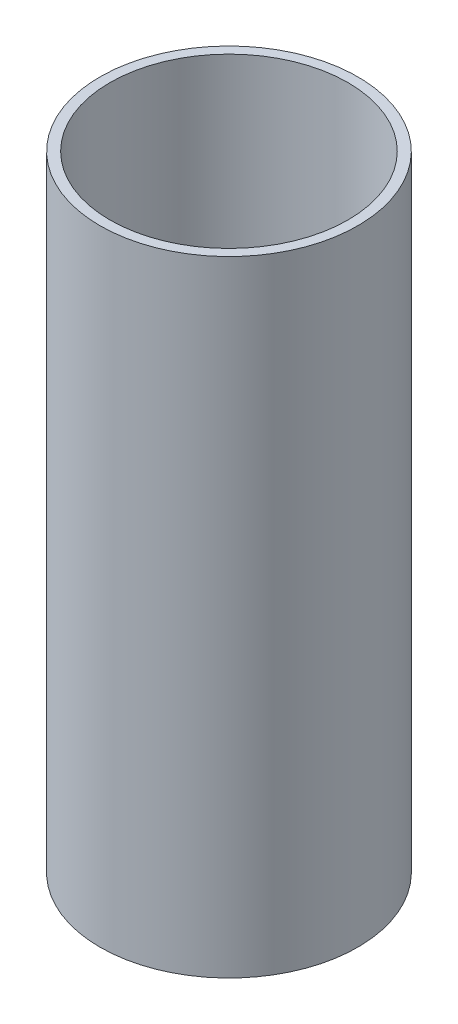
ISO-10303-21;
HEADER;
FILE_DESCRIPTION(('STEP AP214'),'2;1');
FILE_NAME('part.step','',(''),(''),'','','');
FILE_SCHEMA(('AUTOMOTIVE_DESIGN { 1 0 10303 214 1 1 1 1 }'));
ENDSEC;
DATA;
#1=APPLICATION_CONTEXT('core data for automotive mechanical design processes');
#2=APPLICATION_PROTOCOL_DEFINITION('international standard','automotive_design',2000,#1);
#3=PRODUCT_CONTEXT('',#1,'mechanical');
#4=PRODUCT('Part','Part','',(#3));
#5=PRODUCT_RELATED_PRODUCT_CATEGORY('part','',(#4));
#6=PRODUCT_DEFINITION_FORMATION('','',#4);
#7=PRODUCT_DEFINITION_CONTEXT('part definition',#1,'design');
#8=PRODUCT_DEFINITION('design','',#6,#7);
#9=PRODUCT_DEFINITION_SHAPE('','',#8);
#10=(LENGTH_UNIT() NAMED_UNIT(*) SI_UNIT(.MILLI.,.METRE.));
#11=(NAMED_UNIT(*) PLANE_ANGLE_UNIT() SI_UNIT($,.RADIAN.));
#12=(NAMED_UNIT(*) SI_UNIT($,.STERADIAN.) SOLID_ANGLE_UNIT());
#13=UNCERTAINTY_MEASURE_WITH_UNIT(LENGTH_MEASURE(1.E-05),#10,'distance_accuracy_value','');
#14=(GEOMETRIC_REPRESENTATION_CONTEXT(3) GLOBAL_UNCERTAINTY_ASSIGNED_CONTEXT((#13)) GLOBAL_UNIT_ASSIGNED_CONTEXT((#10,
#11,#12)) REPRESENTATION_CONTEXT('',''));
#15=CARTESIAN_POINT('',(0.,0.,0.));
#16=DIRECTION('',(0.,0.,1.));
#17=DIRECTION('',(1.,0.,0.));
#18=AXIS2_PLACEMENT_3D('',#15,#16,#17);
#19=CARTESIAN_POINT('',(0.,200.,0.));
#20=DIRECTION('',(0.,1.,0.));
#21=DIRECTION('',(0.,0.,1.));
#22=AXIS2_PLACEMENT_3D('',#19,#20,#21);
#23=PLANE('',#22);
#24=CARTESIAN_POINT('',(0.,200.,0.));
#25=DIRECTION('',(0.,1.,0.));
#26=DIRECTION('',(0.,0.,1.));
#27=AXIS2_PLACEMENT_3D('',#24,#25,#26);
#28=CIRCLE('',#27,41.275);
#29=CARTESIAN_POINT('',(0.,200.,41.275));
#30=VERTEX_POINT('',#29);
#31=EDGE_CURVE('E10',#30,#30,#28,.T.);
#32=ORIENTED_EDGE('',*,*,#31,.T.);
#33=EDGE_LOOP('',(#32));
#34=FACE_BOUND('',#33,.T.);
#35=CARTESIAN_POINT('',(0.,200.,0.));
#36=DIRECTION('',(0.,1.,0.));
#37=DIRECTION('',(0.,0.,1.));
#38=AXIS2_PLACEMENT_3D('',#35,#36,#37);
#39=CIRCLE('',#38,38.1);
#40=CARTESIAN_POINT('',(0.,200.,38.1));
#41=VERTEX_POINT('',#40);
#42=EDGE_CURVE('E42',#41,#41,#39,.T.);
#43=ORIENTED_EDGE('',*,*,#42,.F.);
#44=EDGE_LOOP('',(#43));
#45=FACE_BOUND('',#44,.T.);
#46=ADVANCED_FACE('F31',(#34,#45),#23,.T.);
#47=CARTESIAN_POINT('',(0.,0.,0.));
#48=DIRECTION('',(0.,1.,0.));
#49=DIRECTION('',(0.,0.,1.));
#50=AXIS2_PLACEMENT_3D('',#47,#48,#49);
#51=PLANE('',#50);
#52=CARTESIAN_POINT('',(0.,0.,0.));
#53=DIRECTION('',(0.,1.,0.));
#54=DIRECTION('',(0.,0.,1.));
#55=AXIS2_PLACEMENT_3D('',#52,#53,#54);
#56=CIRCLE('',#55,41.275);
#57=CARTESIAN_POINT('',(0.,0.,41.275));
#58=VERTEX_POINT('',#57);
#59=EDGE_CURVE('E35',#58,#58,#56,.T.);
#60=ORIENTED_EDGE('',*,*,#59,.F.);
#61=EDGE_LOOP('',(#60));
#62=FACE_BOUND('',#61,.T.);
#63=CARTESIAN_POINT('',(0.,0.,0.));
#64=DIRECTION('',(0.,1.,0.));
#65=DIRECTION('',(0.,0.,1.));
#66=AXIS2_PLACEMENT_3D('',#63,#64,#65);
#67=CIRCLE('',#66,38.1);
#68=CARTESIAN_POINT('',(0.,0.,38.1));
#69=VERTEX_POINT('',#68);
#70=EDGE_CURVE('E44',#69,#69,#67,.T.);
#71=ORIENTED_EDGE('',*,*,#70,.T.);
#72=EDGE_LOOP('',(#71));
#73=FACE_BOUND('',#72,.T.);
#74=ADVANCED_FACE('F54',(#62,#73),#51,.F.);
#75=CARTESIAN_POINT('',(0.,200.,0.));
#76=DIRECTION('',(0.,-1.,0.));
#77=DIRECTION('',(0.,0.,-1.));
#78=AXIS2_PLACEMENT_3D('',#75,#76,#77);
#79=CYLINDRICAL_SURFACE('',#78,41.275);
#80=ORIENTED_EDGE('',*,*,#31,.F.);
#81=EDGE_LOOP('',(#80));
#82=FACE_BOUND('',#81,.T.);
#83=ORIENTED_EDGE('',*,*,#59,.T.);
#84=EDGE_LOOP('',(#83));
#85=FACE_BOUND('',#84,.T.);
#86=ADVANCED_FACE('F33',(#82,#85),#79,.T.);
#87=CARTESIAN_POINT('',(0.,200.,0.));
#88=DIRECTION('',(0.,-1.,0.));
#89=DIRECTION('',(0.,0.,-1.));
#90=AXIS2_PLACEMENT_3D('',#87,#88,#89);
#91=CYLINDRICAL_SURFACE('',#90,38.1);
#92=ORIENTED_EDGE('',*,*,#42,.T.);
#93=EDGE_LOOP('',(#92));
#94=FACE_BOUND('',#93,.T.);
#95=ORIENTED_EDGE('',*,*,#70,.F.);
#96=EDGE_LOOP('',(#95));
#97=FACE_BOUND('',#96,.T.);
#98=ADVANCED_FACE('F50',(#94,#97),#91,.F.);
#99=CLOSED_SHELL('',(#46,#74,#86,#98));
#100=MANIFOLD_SOLID_BREP('B2',#99);
#101=ADVANCED_BREP_SHAPE_REPRESENTATION('',(#18,#100),#14);
#102=SHAPE_DEFINITION_REPRESENTATION(#9,#101);
ENDSEC;
END-ISO-10303-21;
